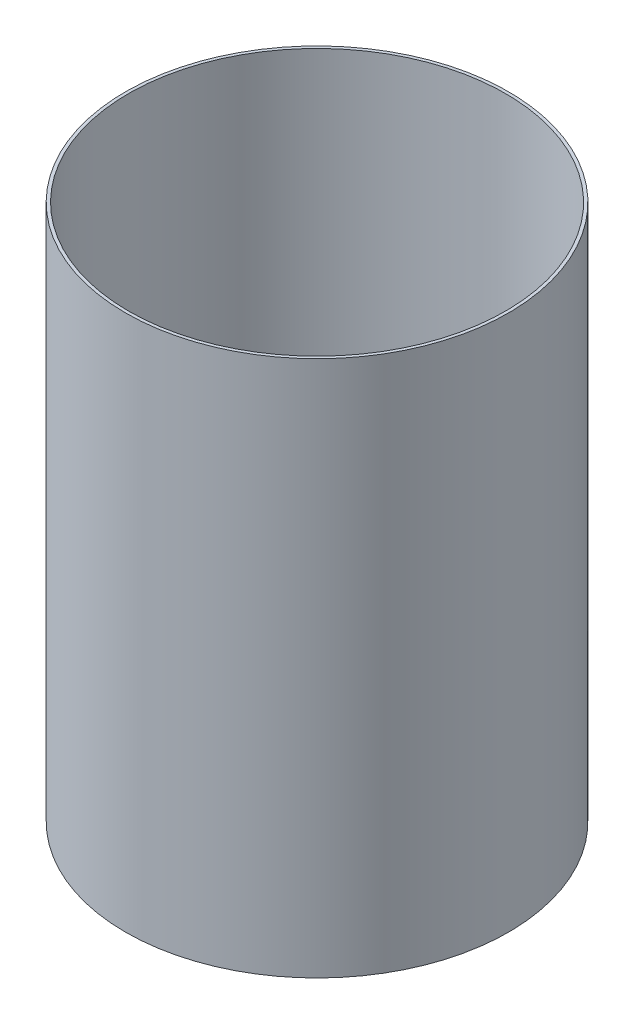
ISO-10303-21;
HEADER;
FILE_DESCRIPTION(('STEP AP214'),'2;1');
FILE_NAME('part.step','',(''),(''),'','','');
FILE_SCHEMA(('AUTOMOTIVE_DESIGN { 1 0 10303 214 1 1 1 1 }'));
ENDSEC;
DATA;
#1=APPLICATION_CONTEXT('core data for automotive mechanical design processes');
#2=APPLICATION_PROTOCOL_DEFINITION('international standard','automotive_design',2000,#1);
#3=PRODUCT_CONTEXT('',#1,'mechanical');
#4=PRODUCT('Part','Part','',(#3));
#5=PRODUCT_RELATED_PRODUCT_CATEGORY('part','',(#4));
#6=PRODUCT_DEFINITION_FORMATION('','',#4);
#7=PRODUCT_DEFINITION_CONTEXT('part definition',#1,'design');
#8=PRODUCT_DEFINITION('design','',#6,#7);
#9=PRODUCT_DEFINITION_SHAPE('','',#8);
#10=(LENGTH_UNIT() NAMED_UNIT(*) SI_UNIT(.MILLI.,.METRE.));
#11=(NAMED_UNIT(*) PLANE_ANGLE_UNIT() SI_UNIT($,.RADIAN.));
#12=(NAMED_UNIT(*) SI_UNIT($,.STERADIAN.) SOLID_ANGLE_UNIT());
#13=UNCERTAINTY_MEASURE_WITH_UNIT(LENGTH_MEASURE(1.E-05),#10,'distance_accuracy_value','');
#14=(GEOMETRIC_REPRESENTATION_CONTEXT(3) GLOBAL_UNCERTAINTY_ASSIGNED_CONTEXT((#13)) GLOBAL_UNIT_ASSIGNED_CONTEXT((#10,
#11,#12)) REPRESENTATION_CONTEXT('',''));
#15=CARTESIAN_POINT('',(0.,0.,0.));
#16=DIRECTION('',(0.,0.,1.));
#17=DIRECTION('',(1.,0.,0.));
#18=AXIS2_PLACEMENT_3D('',#15,#16,#17);
#19=CARTESIAN_POINT('',(0.,87.5,0.));
#20=DIRECTION('',(0.,1.,0.));
#21=DIRECTION('',(0.,0.,1.));
#22=AXIS2_PLACEMENT_3D('',#19,#20,#21);
#23=PLANE('',#22);
#24=CARTESIAN_POINT('',(0.,87.5,0.));
#25=DIRECTION('',(0.,1.,0.));
#26=DIRECTION('',(0.,0.,1.));
#27=AXIS2_PLACEMENT_3D('',#24,#25,#26);
#28=CIRCLE('',#27,62.5);
#29=CARTESIAN_POINT('',(0.,87.5,62.5));
#30=VERTEX_POINT('',#29);
#31=EDGE_CURVE('E10',#30,#30,#28,.T.);
#32=ORIENTED_EDGE('',*,*,#31,.T.);
#33=EDGE_LOOP('',(#32));
#34=FACE_BOUND('',#33,.T.);
#35=CARTESIAN_POINT('',(0.,87.5,0.));
#36=DIRECTION('',(0.,1.,0.));
#37=DIRECTION('',(0.,0.,1.));
#38=AXIS2_PLACEMENT_3D('',#35,#36,#37);
#39=CIRCLE('',#38,61.5);
#40=CARTESIAN_POINT('',(0.,87.5,61.5));
#41=VERTEX_POINT('',#40);
#42=EDGE_CURVE('E46',#41,#41,#39,.T.);
#43=ORIENTED_EDGE('',*,*,#42,.F.);
#44=EDGE_LOOP('',(#43));
#45=FACE_BOUND('',#44,.T.);
#46=ADVANCED_FACE('F35',(#34,#45),#23,.T.);
#47=CARTESIAN_POINT('',(0.,-87.5,0.));
#48=DIRECTION('',(0.,1.,0.));
#49=DIRECTION('',(0.,0.,1.));
#50=AXIS2_PLACEMENT_3D('',#47,#48,#49);
#51=PLANE('',#50);
#52=CARTESIAN_POINT('',(0.,-87.5,0.));
#53=DIRECTION('',(0.,1.,0.));
#54=DIRECTION('',(0.,0.,1.));
#55=AXIS2_PLACEMENT_3D('',#52,#53,#54);
#56=CIRCLE('',#55,62.5);
#57=CARTESIAN_POINT('',(0.,-87.5,62.5));
#58=VERTEX_POINT('',#57);
#59=EDGE_CURVE('E39',#58,#58,#56,.T.);
#60=ORIENTED_EDGE('',*,*,#59,.F.);
#61=EDGE_LOOP('',(#60));
#62=FACE_BOUND('',#61,.T.);
#63=CARTESIAN_POINT('',(0.,-87.5,0.));
#64=DIRECTION('',(0.,1.,0.));
#65=DIRECTION('',(0.,0.,1.));
#66=AXIS2_PLACEMENT_3D('',#63,#64,#65);
#67=CIRCLE('',#66,61.5);
#68=CARTESIAN_POINT('',(0.,-87.5,61.5));
#69=VERTEX_POINT('',#68);
#70=EDGE_CURVE('E48',#69,#69,#67,.T.);
#71=ORIENTED_EDGE('',*,*,#70,.T.);
#72=EDGE_LOOP('',(#71));
#73=FACE_BOUND('',#72,.T.);
#74=ADVANCED_FACE('F58',(#62,#73),#51,.F.);
#75=CARTESIAN_POINT('',(0.,87.5,0.));
#76=DIRECTION('',(0.,-1.,0.));
#77=DIRECTION('',(0.,0.,-1.));
#78=AXIS2_PLACEMENT_3D('',#75,#76,#77);
#79=CYLINDRICAL_SURFACE('',#78,62.5);
#80=ORIENTED_EDGE('',*,*,#31,.F.);
#81=EDGE_LOOP('',(#80));
#82=FACE_BOUND('',#81,.T.);
#83=ORIENTED_EDGE('',*,*,#59,.T.);
#84=EDGE_LOOP('',(#83));
#85=FACE_BOUND('',#84,.T.);
#86=ADVANCED_FACE('F37',(#82,#85),#79,.T.);
#87=CARTESIAN_POINT('',(0.,87.5,0.));
#88=DIRECTION('',(0.,-1.,0.));
#89=DIRECTION('',(0.,0.,-1.));
#90=AXIS2_PLACEMENT_3D('',#87,#88,#89);
#91=CYLINDRICAL_SURFACE('',#90,61.5);
#92=ORIENTED_EDGE('',*,*,#42,.T.);
#93=EDGE_LOOP('',(#92));
#94=FACE_BOUND('',#93,.T.);
#95=ORIENTED_EDGE('',*,*,#70,.F.);
#96=EDGE_LOOP('',(#95));
#97=FACE_BOUND('',#96,.T.);
#98=ADVANCED_FACE('F54',(#94,#97),#91,.F.);
#99=CLOSED_SHELL('',(#46,#74,#86,#98));
#100=MANIFOLD_SOLID_BREP('B2',#99);
#101=ADVANCED_BREP_SHAPE_REPRESENTATION('',(#18,#100),#14);
#102=SHAPE_DEFINITION_REPRESENTATION(#9,#101);
ENDSEC;
END-ISO-10303-21;
